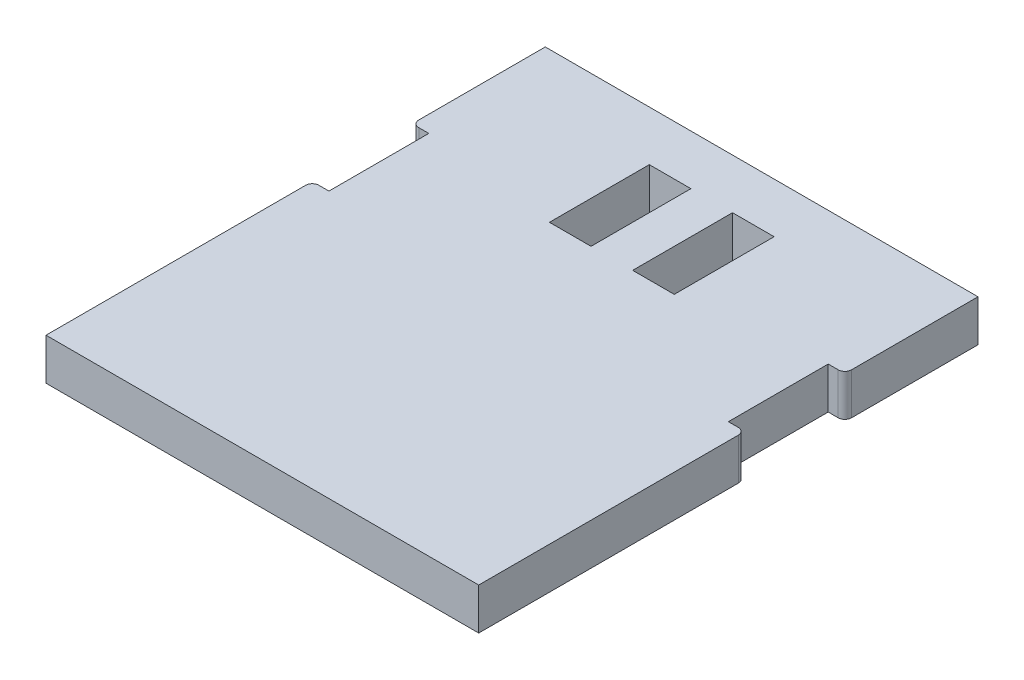
ISO-10303-21;
HEADER;
FILE_DESCRIPTION(('STEP AP214'),'2;1');
FILE_NAME('part.step','',(''),(''),'','','');
FILE_SCHEMA(('AUTOMOTIVE_DESIGN { 1 0 10303 214 1 1 1 1 }'));
ENDSEC;
DATA;
#1=APPLICATION_CONTEXT('core data for automotive mechanical design processes');
#2=APPLICATION_PROTOCOL_DEFINITION('international standard','automotive_design',2000,#1);
#3=PRODUCT_CONTEXT('',#1,'mechanical');
#4=PRODUCT('Part','Part','',(#3));
#5=PRODUCT_RELATED_PRODUCT_CATEGORY('part','',(#4));
#6=PRODUCT_DEFINITION_FORMATION('','',#4);
#7=PRODUCT_DEFINITION_CONTEXT('part definition',#1,'design');
#8=PRODUCT_DEFINITION('design','',#6,#7);
#9=PRODUCT_DEFINITION_SHAPE('','',#8);
#10=(LENGTH_UNIT() NAMED_UNIT(*) SI_UNIT(.MILLI.,.METRE.));
#11=(NAMED_UNIT(*) PLANE_ANGLE_UNIT() SI_UNIT($,.RADIAN.));
#12=(NAMED_UNIT(*) SI_UNIT($,.STERADIAN.) SOLID_ANGLE_UNIT());
#13=UNCERTAINTY_MEASURE_WITH_UNIT(LENGTH_MEASURE(1.E-05),#10,'distance_accuracy_value','');
#14=(GEOMETRIC_REPRESENTATION_CONTEXT(3) GLOBAL_UNCERTAINTY_ASSIGNED_CONTEXT((#13)) GLOBAL_UNIT_ASSIGNED_CONTEXT((#10,
#11,#12)) REPRESENTATION_CONTEXT('',''));
#15=CARTESIAN_POINT('',(0.,0.,0.));
#16=DIRECTION('',(0.,0.,1.));
#17=DIRECTION('',(1.,0.,0.));
#18=AXIS2_PLACEMENT_3D('',#15,#16,#17);
#19=CARTESIAN_POINT('',(0.,3.175,0.));
#20=DIRECTION('',(1.,0.,0.));
#21=DIRECTION('',(0.,0.,-1.));
#22=AXIS2_PLACEMENT_3D('',#19,#20,#21);
#23=PLANE('',#22);
#24=DIRECTION('',(0.,0.,1.));
#25=VECTOR('',#24,1.);
#26=CARTESIAN_POINT('',(0.,3.175,0.));
#27=LINE('',#26,#25);
#28=CARTESIAN_POINT('',(0.,3.175,-19.812));
#29=VERTEX_POINT('',#28);
#30=CARTESIAN_POINT('',(0.,3.175,0.));
#31=VERTEX_POINT('',#30);
#32=EDGE_CURVE('E321',#29,#31,#27,.T.);
#33=ORIENTED_EDGE('',*,*,#32,.F.);
#34=DIRECTION('',(0.,-1.,0.));
#35=VECTOR('',#34,1.);
#36=CARTESIAN_POINT('',(0.,3.175,-19.812));
#37=LINE('',#36,#35);
#38=CARTESIAN_POINT('',(0.,0.,-19.812));
#39=VERTEX_POINT('',#38);
#40=EDGE_CURVE('E47',#29,#39,#37,.T.);
#41=ORIENTED_EDGE('',*,*,#40,.T.);
#42=DIRECTION('',(0.,0.,1.));
#43=VECTOR('',#42,1.);
#44=CARTESIAN_POINT('',(0.,0.,0.));
#45=LINE('',#44,#43);
#46=CARTESIAN_POINT('',(0.,0.,0.));
#47=VERTEX_POINT('',#46);
#48=EDGE_CURVE('E316',#39,#47,#45,.T.);
#49=ORIENTED_EDGE('',*,*,#48,.T.);
#50=DIRECTION('',(0.,-1.,0.));
#51=VECTOR('',#50,1.);
#52=CARTESIAN_POINT('',(0.,3.175,0.));
#53=LINE('',#52,#51);
#54=EDGE_CURVE('E347',#31,#47,#53,.T.);
#55=ORIENTED_EDGE('',*,*,#54,.F.);
#56=EDGE_LOOP('',(#33,#41,#49,#55));
#57=FACE_BOUND('',#56,.T.);
#58=ADVANCED_FACE('F39',(#57),#23,.F.);
#59=CARTESIAN_POINT('',(33.02,3.175,0.));
#60=DIRECTION('',(-1.,0.,0.));
#61=DIRECTION('',(0.,0.,1.));
#62=AXIS2_PLACEMENT_3D('',#59,#60,#61);
#63=PLANE('',#62);
#64=DIRECTION('',(0.,0.,-1.));
#65=VECTOR('',#64,1.);
#66=CARTESIAN_POINT('',(33.02,3.175,0.));
#67=LINE('',#66,#65);
#68=CARTESIAN_POINT('',(33.02,3.175,-28.448));
#69=VERTEX_POINT('',#68);
#70=CARTESIAN_POINT('',(33.02,3.175,-38.1));
#71=VERTEX_POINT('',#70);
#72=EDGE_CURVE('E323',#69,#71,#67,.T.);
#73=ORIENTED_EDGE('',*,*,#72,.F.);
#74=DIRECTION('',(0.,-1.,0.));
#75=VECTOR('',#74,1.);
#76=CARTESIAN_POINT('',(33.02,3.175,-28.448));
#77=LINE('',#76,#75);
#78=CARTESIAN_POINT('',(33.02,0.,-28.448));
#79=VERTEX_POINT('',#78);
#80=EDGE_CURVE('E350',#69,#79,#77,.T.);
#81=ORIENTED_EDGE('',*,*,#80,.T.);
#82=DIRECTION('',(0.,0.,-1.));
#83=VECTOR('',#82,1.);
#84=CARTESIAN_POINT('',(33.02,0.,0.));
#85=LINE('',#84,#83);
#86=CARTESIAN_POINT('',(33.02,0.,-38.1));
#87=VERTEX_POINT('',#86);
#88=EDGE_CURVE('E334',#79,#87,#85,.T.);
#89=ORIENTED_EDGE('',*,*,#88,.T.);
#90=DIRECTION('',(0.,-1.,0.));
#91=VECTOR('',#90,1.);
#92=CARTESIAN_POINT('',(33.02,3.175,-38.1));
#93=LINE('',#92,#91);
#94=EDGE_CURVE('E341',#71,#87,#93,.T.);
#95=ORIENTED_EDGE('',*,*,#94,.F.);
#96=EDGE_LOOP('',(#73,#81,#89,#95));
#97=FACE_BOUND('',#96,.T.);
#98=ADVANCED_FACE('F427',(#97),#63,.F.);
#99=CARTESIAN_POINT('',(0.,3.175,0.));
#100=DIRECTION('',(0.,-1.,0.));
#101=DIRECTION('',(0.,0.,-1.));
#102=AXIS2_PLACEMENT_3D('',#99,#100,#101);
#103=PLANE('',#102);
#104=DIRECTION('',(0.,0.,1.));
#105=VECTOR('',#104,1.);
#106=CARTESIAN_POINT('',(11.7475,3.175,-34.29));
#107=LINE('',#106,#105);
#108=CARTESIAN_POINT('',(11.7475,3.175,-34.29));
#109=VERTEX_POINT('',#108);
#110=CARTESIAN_POINT('',(11.7475,3.175,-26.67));
#111=VERTEX_POINT('',#110);
#112=EDGE_CURVE('E286',#109,#111,#107,.T.);
#113=ORIENTED_EDGE('',*,*,#112,.F.);
#114=DIRECTION('',(-1.,0.,0.));
#115=VECTOR('',#114,1.);
#116=CARTESIAN_POINT('',(11.7475,3.175,-34.29));
#117=LINE('',#116,#115);
#118=CARTESIAN_POINT('',(14.9225,3.175,-34.29));
#119=VERTEX_POINT('',#118);
#120=EDGE_CURVE('E294',#119,#109,#117,.T.);
#121=ORIENTED_EDGE('',*,*,#120,.F.);
#122=DIRECTION('',(0.,0.,-1.));
#123=VECTOR('',#122,1.);
#124=CARTESIAN_POINT('',(14.9225,3.175,-34.29));
#125=LINE('',#124,#123);
#126=CARTESIAN_POINT('',(14.9225,3.175,-26.67));
#127=VERTEX_POINT('',#126);
#128=EDGE_CURVE('E291',#127,#119,#125,.T.);
#129=ORIENTED_EDGE('',*,*,#128,.F.);
#130=DIRECTION('',(1.,0.,0.));
#131=VECTOR('',#130,1.);
#132=CARTESIAN_POINT('',(11.7475,3.175,-26.67));
#133=LINE('',#132,#131);
#134=EDGE_CURVE('E288',#111,#127,#133,.T.);
#135=ORIENTED_EDGE('',*,*,#134,.F.);
#136=EDGE_LOOP('',(#113,#121,#129,#135));
#137=FACE_BOUND('',#136,.T.);
#138=DIRECTION('',(1.,0.,0.));
#139=VECTOR('',#138,1.);
#140=CARTESIAN_POINT('',(33.02,3.175,-27.94));
#141=LINE('',#140,#139);
#142=CARTESIAN_POINT('',(31.75,3.175,-27.94));
#143=VERTEX_POINT('',#142);
#144=CARTESIAN_POINT('',(32.512,3.175,-27.94));
#145=VERTEX_POINT('',#144);
#146=EDGE_CURVE('E220',#143,#145,#141,.T.);
#147=ORIENTED_EDGE('',*,*,#146,.T.);
#148=CARTESIAN_POINT('',(32.512,3.175,-28.448));
#149=DIRECTION('',(0.,-1.,0.));
#150=DIRECTION('',(0.,0.,-1.));
#151=AXIS2_PLACEMENT_3D('',#148,#149,#150);
#152=CIRCLE('',#151,0.508);
#153=EDGE_CURVE('E368',#145,#69,#152,.F.);
#154=ORIENTED_EDGE('',*,*,#153,.T.);
#155=ORIENTED_EDGE('',*,*,#72,.T.);
#156=DIRECTION('',(-1.,0.,0.));
#157=VECTOR('',#156,1.);
#158=CARTESIAN_POINT('',(0.,3.175,-38.1));
#159=LINE('',#158,#157);
#160=CARTESIAN_POINT('',(0.,3.175,-38.1));
#161=VERTEX_POINT('',#160);
#162=EDGE_CURVE('E326',#71,#161,#159,.T.);
#163=ORIENTED_EDGE('',*,*,#162,.T.);
#164=CARTESIAN_POINT('',(0.,3.175,-28.448));
#165=VERTEX_POINT('',#164);
#166=EDGE_CURVE('E317',#161,#165,#27,.T.);
#167=ORIENTED_EDGE('',*,*,#166,.T.);
#168=CARTESIAN_POINT('',(0.508,3.175,-28.448));
#169=DIRECTION('',(0.,-1.,0.));
#170=DIRECTION('',(0.,0.,-1.));
#171=AXIS2_PLACEMENT_3D('',#168,#169,#170);
#172=CIRCLE('',#171,0.508);
#173=CARTESIAN_POINT('',(0.508,3.175,-27.94));
#174=VERTEX_POINT('',#173);
#175=EDGE_CURVE('E365',#165,#174,#172,.F.);
#176=ORIENTED_EDGE('',*,*,#175,.T.);
#177=DIRECTION('',(1.,0.,0.));
#178=VECTOR('',#177,1.);
#179=CARTESIAN_POINT('',(0.,3.175,-27.94));
#180=LINE('',#179,#178);
#181=CARTESIAN_POINT('',(1.27,3.175,-27.94));
#182=VERTEX_POINT('',#181);
#183=EDGE_CURVE('E245',#174,#182,#180,.T.);
#184=ORIENTED_EDGE('',*,*,#183,.T.);
#185=DIRECTION('',(0.,0.,1.));
#186=VECTOR('',#185,1.);
#187=CARTESIAN_POINT('',(1.27,3.175,-20.32));
#188=LINE('',#187,#186);
#189=CARTESIAN_POINT('',(1.27,3.175,-20.32));
#190=VERTEX_POINT('',#189);
#191=EDGE_CURVE('E251',#182,#190,#188,.T.);
#192=ORIENTED_EDGE('',*,*,#191,.T.);
#193=DIRECTION('',(-1.,0.,0.));
#194=VECTOR('',#193,1.);
#195=CARTESIAN_POINT('',(0.,3.175,-20.32));
#196=LINE('',#195,#194);
#197=CARTESIAN_POINT('',(0.508,3.175,-20.32));
#198=VERTEX_POINT('',#197);
#199=EDGE_CURVE('E238',#190,#198,#196,.T.);
#200=ORIENTED_EDGE('',*,*,#199,.T.);
#201=CARTESIAN_POINT('',(0.508,3.175,-19.812));
#202=DIRECTION('',(0.,-1.,0.));
#203=DIRECTION('',(0.,0.,-1.));
#204=AXIS2_PLACEMENT_3D('',#201,#202,#203);
#205=CIRCLE('',#204,0.508);
#206=EDGE_CURVE('E363',#198,#29,#205,.F.);
#207=ORIENTED_EDGE('',*,*,#206,.T.);
#208=ORIENTED_EDGE('',*,*,#32,.T.);
#209=DIRECTION('',(1.,0.,0.));
#210=VECTOR('',#209,1.);
#211=CARTESIAN_POINT('',(0.,3.175,0.));
#212=LINE('',#211,#210);
#213=CARTESIAN_POINT('',(33.02,3.175,0.));
#214=VERTEX_POINT('',#213);
#215=EDGE_CURVE('E320',#31,#214,#212,.T.);
#216=ORIENTED_EDGE('',*,*,#215,.T.);
#217=CARTESIAN_POINT('',(33.02,3.175,-19.812));
#218=VERTEX_POINT('',#217);
#219=EDGE_CURVE('E324',#214,#218,#67,.T.);
#220=ORIENTED_EDGE('',*,*,#219,.T.);
#221=CARTESIAN_POINT('',(32.512,3.175,-19.812));
#222=DIRECTION('',(0.,-1.,0.));
#223=DIRECTION('',(0.,0.,-1.));
#224=AXIS2_PLACEMENT_3D('',#221,#222,#223);
#225=CIRCLE('',#224,0.508);
#226=CARTESIAN_POINT('',(32.512,3.175,-20.32));
#227=VERTEX_POINT('',#226);
#228=EDGE_CURVE('E54',#218,#227,#225,.F.);
#229=ORIENTED_EDGE('',*,*,#228,.T.);
#230=DIRECTION('',(-1.,0.,0.));
#231=VECTOR('',#230,1.);
#232=CARTESIAN_POINT('',(33.02,3.175,-20.32));
#233=LINE('',#232,#231);
#234=CARTESIAN_POINT('',(31.75,3.175,-20.32));
#235=VERTEX_POINT('',#234);
#236=EDGE_CURVE('E199',#227,#235,#233,.T.);
#237=ORIENTED_EDGE('',*,*,#236,.T.);
#238=DIRECTION('',(0.,0.,-1.));
#239=VECTOR('',#238,1.);
#240=CARTESIAN_POINT('',(31.75,3.175,-20.32));
#241=LINE('',#240,#239);
#242=EDGE_CURVE('E205',#235,#143,#241,.T.);
#243=ORIENTED_EDGE('',*,*,#242,.T.);
#244=EDGE_LOOP('',(#147,#154,#155,#163,#167,#176,#184,#192,#200,#207,#208,#216,#220,#229,#237,#243));
#245=FACE_BOUND('',#244,.T.);
#246=DIRECTION('',(0.,0.,1.));
#247=VECTOR('',#246,1.);
#248=CARTESIAN_POINT('',(18.0975,3.175,-34.29));
#249=LINE('',#248,#247);
#250=CARTESIAN_POINT('',(18.0975,3.175,-34.29));
#251=VERTEX_POINT('',#250);
#252=CARTESIAN_POINT('',(18.0975,3.175,-26.67));
#253=VERTEX_POINT('',#252);
#254=EDGE_CURVE('E255',#251,#253,#249,.T.);
#255=ORIENTED_EDGE('',*,*,#254,.F.);
#256=DIRECTION('',(-1.,0.,0.));
#257=VECTOR('',#256,1.);
#258=CARTESIAN_POINT('',(18.0975,3.175,-34.29));
#259=LINE('',#258,#257);
#260=CARTESIAN_POINT('',(21.2725,3.175,-34.29));
#261=VERTEX_POINT('',#260);
#262=EDGE_CURVE('E263',#261,#251,#259,.T.);
#263=ORIENTED_EDGE('',*,*,#262,.F.);
#264=DIRECTION('',(0.,0.,-1.));
#265=VECTOR('',#264,1.);
#266=CARTESIAN_POINT('',(21.2725,3.175,-34.29));
#267=LINE('',#266,#265);
#268=CARTESIAN_POINT('',(21.2725,3.175,-26.67));
#269=VERTEX_POINT('',#268);
#270=EDGE_CURVE('E260',#269,#261,#267,.T.);
#271=ORIENTED_EDGE('',*,*,#270,.F.);
#272=DIRECTION('',(1.,0.,0.));
#273=VECTOR('',#272,1.);
#274=CARTESIAN_POINT('',(18.0975,3.175,-26.67));
#275=LINE('',#274,#273);
#276=EDGE_CURVE('E257',#253,#269,#275,.T.);
#277=ORIENTED_EDGE('',*,*,#276,.F.);
#278=EDGE_LOOP('',(#255,#263,#271,#277));
#279=FACE_BOUND('',#278,.T.);
#280=ADVANCED_FACE('F202',(#137,#245,#279),#103,.F.);
#281=CARTESIAN_POINT('',(0.,0.,0.));
#282=DIRECTION('',(0.,-1.,0.));
#283=DIRECTION('',(0.,0.,-1.));
#284=AXIS2_PLACEMENT_3D('',#281,#282,#283);
#285=PLANE('',#284);
#286=ORIENTED_EDGE('',*,*,#88,.F.);
#287=CARTESIAN_POINT('',(32.512,0.,-28.448));
#288=DIRECTION('',(0.,-1.,0.));
#289=DIRECTION('',(0.,0.,-1.));
#290=AXIS2_PLACEMENT_3D('',#287,#288,#289);
#291=CIRCLE('',#290,0.508);
#292=CARTESIAN_POINT('',(32.512,0.,-27.94));
#293=VERTEX_POINT('',#292);
#294=EDGE_CURVE('E359',#79,#293,#291,.T.);
#295=ORIENTED_EDGE('',*,*,#294,.T.);
#296=DIRECTION('',(1.,0.,0.));
#297=VECTOR('',#296,1.);
#298=CARTESIAN_POINT('',(33.02,0.,-27.94));
#299=LINE('',#298,#297);
#300=CARTESIAN_POINT('',(31.75,0.,-27.94));
#301=VERTEX_POINT('',#300);
#302=EDGE_CURVE('E209',#301,#293,#299,.T.);
#303=ORIENTED_EDGE('',*,*,#302,.F.);
#304=DIRECTION('',(0.,0.,-1.));
#305=VECTOR('',#304,1.);
#306=CARTESIAN_POINT('',(31.75,0.,-20.32));
#307=LINE('',#306,#305);
#308=CARTESIAN_POINT('',(31.75,0.,-20.32));
#309=VERTEX_POINT('',#308);
#310=EDGE_CURVE('E228',#309,#301,#307,.T.);
#311=ORIENTED_EDGE('',*,*,#310,.F.);
#312=DIRECTION('',(-1.,0.,0.));
#313=VECTOR('',#312,1.);
#314=CARTESIAN_POINT('',(33.02,0.,-20.32));
#315=LINE('',#314,#313);
#316=CARTESIAN_POINT('',(32.512,0.,-20.32));
#317=VERTEX_POINT('',#316);
#318=EDGE_CURVE('E215',#317,#309,#315,.T.);
#319=ORIENTED_EDGE('',*,*,#318,.F.);
#320=CARTESIAN_POINT('',(32.512,0.,-19.812));
#321=DIRECTION('',(0.,-1.,0.));
#322=DIRECTION('',(0.,0.,-1.));
#323=AXIS2_PLACEMENT_3D('',#320,#321,#322);
#324=CIRCLE('',#323,0.508);
#325=CARTESIAN_POINT('',(33.02,0.,-19.812));
#326=VERTEX_POINT('',#325);
#327=EDGE_CURVE('E357',#317,#326,#324,.T.);
#328=ORIENTED_EDGE('',*,*,#327,.T.);
#329=CARTESIAN_POINT('',(33.02,0.,0.));
#330=VERTEX_POINT('',#329);
#331=EDGE_CURVE('E335',#330,#326,#85,.T.);
#332=ORIENTED_EDGE('',*,*,#331,.F.);
#333=DIRECTION('',(1.,0.,0.));
#334=VECTOR('',#333,1.);
#335=CARTESIAN_POINT('',(0.,0.,0.));
#336=LINE('',#335,#334);
#337=EDGE_CURVE('E332',#47,#330,#336,.T.);
#338=ORIENTED_EDGE('',*,*,#337,.F.);
#339=ORIENTED_EDGE('',*,*,#48,.F.);
#340=CARTESIAN_POINT('',(0.508,0.,-19.812));
#341=DIRECTION('',(0.,-1.,0.));
#342=DIRECTION('',(0.,0.,-1.));
#343=AXIS2_PLACEMENT_3D('',#340,#341,#342);
#344=CIRCLE('',#343,0.508);
#345=CARTESIAN_POINT('',(0.508,0.,-20.32));
#346=VERTEX_POINT('',#345);
#347=EDGE_CURVE('E353',#39,#346,#344,.T.);
#348=ORIENTED_EDGE('',*,*,#347,.T.);
#349=DIRECTION('',(-1.,0.,0.));
#350=VECTOR('',#349,1.);
#351=CARTESIAN_POINT('',(0.,0.,-20.32));
#352=LINE('',#351,#350);
#353=CARTESIAN_POINT('',(1.27,0.,-20.32));
#354=VERTEX_POINT('',#353);
#355=EDGE_CURVE('E241',#354,#346,#352,.T.);
#356=ORIENTED_EDGE('',*,*,#355,.F.);
#357=DIRECTION('',(0.,0.,1.));
#358=VECTOR('',#357,1.);
#359=CARTESIAN_POINT('',(1.27,0.,-20.32));
#360=LINE('',#359,#358);
#361=CARTESIAN_POINT('',(1.27,0.,-27.94));
#362=VERTEX_POINT('',#361);
#363=EDGE_CURVE('E244',#362,#354,#360,.T.);
#364=ORIENTED_EDGE('',*,*,#363,.F.);
#365=DIRECTION('',(1.,0.,0.));
#366=VECTOR('',#365,1.);
#367=CARTESIAN_POINT('',(0.,0.,-27.94));
#368=LINE('',#367,#366);
#369=CARTESIAN_POINT('',(0.508,0.,-27.94));
#370=VERTEX_POINT('',#369);
#371=EDGE_CURVE('E229',#370,#362,#368,.T.);
#372=ORIENTED_EDGE('',*,*,#371,.F.);
#373=CARTESIAN_POINT('',(0.508,0.,-28.448));
#374=DIRECTION('',(0.,-1.,0.));
#375=DIRECTION('',(0.,0.,-1.));
#376=AXIS2_PLACEMENT_3D('',#373,#374,#375);
#377=CIRCLE('',#376,0.508);
#378=CARTESIAN_POINT('',(0.,0.,-28.448));
#379=VERTEX_POINT('',#378);
#380=EDGE_CURVE('E355',#370,#379,#377,.T.);
#381=ORIENTED_EDGE('',*,*,#380,.T.);
#382=CARTESIAN_POINT('',(0.,0.,-38.1));
#383=VERTEX_POINT('',#382);
#384=EDGE_CURVE('E329',#383,#379,#45,.T.);
#385=ORIENTED_EDGE('',*,*,#384,.F.);
#386=DIRECTION('',(-1.,0.,0.));
#387=VECTOR('',#386,1.);
#388=CARTESIAN_POINT('',(0.,0.,-38.1));
#389=LINE('',#388,#387);
#390=EDGE_CURVE('E337',#87,#383,#389,.T.);
#391=ORIENTED_EDGE('',*,*,#390,.F.);
#392=EDGE_LOOP('',(#286,#295,#303,#311,#319,#328,#332,#338,#339,#348,#356,#364,#372,#381,#385,#391));
#393=FACE_BOUND('',#392,.T.);
#394=DIRECTION('',(-1.,0.,0.));
#395=VECTOR('',#394,1.);
#396=CARTESIAN_POINT('',(11.7475,0.,-34.29));
#397=LINE('',#396,#395);
#398=CARTESIAN_POINT('',(14.9225,0.,-34.29));
#399=VERTEX_POINT('',#398);
#400=CARTESIAN_POINT('',(11.7475,0.,-34.29));
#401=VERTEX_POINT('',#400);
#402=EDGE_CURVE('E289',#399,#401,#397,.T.);
#403=ORIENTED_EDGE('',*,*,#402,.T.);
#404=DIRECTION('',(0.,0.,1.));
#405=VECTOR('',#404,1.);
#406=CARTESIAN_POINT('',(11.7475,0.,-34.29));
#407=LINE('',#406,#405);
#408=CARTESIAN_POINT('',(11.7475,0.,-26.67));
#409=VERTEX_POINT('',#408);
#410=EDGE_CURVE('E285',#401,#409,#407,.T.);
#411=ORIENTED_EDGE('',*,*,#410,.T.);
#412=DIRECTION('',(1.,0.,0.));
#413=VECTOR('',#412,1.);
#414=CARTESIAN_POINT('',(11.7475,0.,-26.67));
#415=LINE('',#414,#413);
#416=CARTESIAN_POINT('',(14.9225,0.,-26.67));
#417=VERTEX_POINT('',#416);
#418=EDGE_CURVE('E299',#409,#417,#415,.T.);
#419=ORIENTED_EDGE('',*,*,#418,.T.);
#420=DIRECTION('',(0.,0.,-1.));
#421=VECTOR('',#420,1.);
#422=CARTESIAN_POINT('',(14.9225,0.,-34.29));
#423=LINE('',#422,#421);
#424=EDGE_CURVE('E302',#417,#399,#423,.T.);
#425=ORIENTED_EDGE('',*,*,#424,.T.);
#426=EDGE_LOOP('',(#403,#411,#419,#425));
#427=FACE_BOUND('',#426,.T.);
#428=DIRECTION('',(-1.,0.,0.));
#429=VECTOR('',#428,1.);
#430=CARTESIAN_POINT('',(18.0975,0.,-34.29));
#431=LINE('',#430,#429);
#432=CARTESIAN_POINT('',(21.2725,0.,-34.29));
#433=VERTEX_POINT('',#432);
#434=CARTESIAN_POINT('',(18.0975,0.,-34.29));
#435=VERTEX_POINT('',#434);
#436=EDGE_CURVE('E258',#433,#435,#431,.T.);
#437=ORIENTED_EDGE('',*,*,#436,.T.);
#438=DIRECTION('',(0.,0.,1.));
#439=VECTOR('',#438,1.);
#440=CARTESIAN_POINT('',(18.0975,0.,-34.29));
#441=LINE('',#440,#439);
#442=CARTESIAN_POINT('',(18.0975,0.,-26.67));
#443=VERTEX_POINT('',#442);
#444=EDGE_CURVE('E233',#435,#443,#441,.T.);
#445=ORIENTED_EDGE('',*,*,#444,.T.);
#446=DIRECTION('',(1.,0.,0.));
#447=VECTOR('',#446,1.);
#448=CARTESIAN_POINT('',(18.0975,0.,-26.67));
#449=LINE('',#448,#447);
#450=CARTESIAN_POINT('',(21.2725,0.,-26.67));
#451=VERTEX_POINT('',#450);
#452=EDGE_CURVE('E268',#443,#451,#449,.T.);
#453=ORIENTED_EDGE('',*,*,#452,.T.);
#454=DIRECTION('',(0.,0.,-1.));
#455=VECTOR('',#454,1.);
#456=CARTESIAN_POINT('',(21.2725,0.,-34.29));
#457=LINE('',#456,#455);
#458=EDGE_CURVE('E271',#451,#433,#457,.T.);
#459=ORIENTED_EDGE('',*,*,#458,.T.);
#460=EDGE_LOOP('',(#437,#445,#453,#459));
#461=FACE_BOUND('',#460,.T.);
#462=ADVANCED_FACE('F388',(#393,#427,#461),#285,.T.);
#463=ORIENTED_EDGE('',*,*,#384,.T.);
#464=DIRECTION('',(0.,-1.,0.));
#465=VECTOR('',#464,1.);
#466=CARTESIAN_POINT('',(0.,3.175,-28.448));
#467=LINE('',#466,#465);
#468=EDGE_CURVE('E376',#379,#165,#467,.F.);
#469=ORIENTED_EDGE('',*,*,#468,.T.);
#470=ORIENTED_EDGE('',*,*,#166,.F.);
#471=DIRECTION('',(0.,-1.,0.));
#472=VECTOR('',#471,1.);
#473=CARTESIAN_POINT('',(0.,3.175,-38.1));
#474=LINE('',#473,#472);
#475=EDGE_CURVE('E328',#161,#383,#474,.T.);
#476=ORIENTED_EDGE('',*,*,#475,.T.);
#477=EDGE_LOOP('',(#463,#469,#470,#476));
#478=FACE_BOUND('',#477,.T.);
#479=ADVANCED_FACE('F417',(#478),#23,.F.);
#480=CARTESIAN_POINT('',(0.,3.175,0.));
#481=DIRECTION('',(0.,0.,-1.));
#482=DIRECTION('',(-1.,0.,0.));
#483=AXIS2_PLACEMENT_3D('',#480,#481,#482);
#484=PLANE('',#483);
#485=ORIENTED_EDGE('',*,*,#337,.T.);
#486=DIRECTION('',(0.,-1.,0.));
#487=VECTOR('',#486,1.);
#488=CARTESIAN_POINT('',(33.02,3.175,0.));
#489=LINE('',#488,#487);
#490=EDGE_CURVE('E344',#214,#330,#489,.T.);
#491=ORIENTED_EDGE('',*,*,#490,.F.);
#492=ORIENTED_EDGE('',*,*,#215,.F.);
#493=ORIENTED_EDGE('',*,*,#54,.T.);
#494=EDGE_LOOP('',(#485,#491,#492,#493));
#495=FACE_BOUND('',#494,.T.);
#496=ADVANCED_FACE('F395',(#495),#484,.F.);
#497=ORIENTED_EDGE('',*,*,#331,.T.);
#498=DIRECTION('',(0.,-1.,0.));
#499=VECTOR('',#498,1.);
#500=CARTESIAN_POINT('',(33.02,3.175,-19.812));
#501=LINE('',#500,#499);
#502=EDGE_CURVE('E62',#326,#218,#501,.F.);
#503=ORIENTED_EDGE('',*,*,#502,.T.);
#504=ORIENTED_EDGE('',*,*,#219,.F.);
#505=ORIENTED_EDGE('',*,*,#490,.T.);
#506=EDGE_LOOP('',(#497,#503,#504,#505));
#507=FACE_BOUND('',#506,.T.);
#508=ADVANCED_FACE('F436',(#507),#63,.F.);
#509=CARTESIAN_POINT('',(0.,3.175,-38.1));
#510=DIRECTION('',(0.,0.,1.));
#511=DIRECTION('',(1.,0.,0.));
#512=AXIS2_PLACEMENT_3D('',#509,#510,#511);
#513=PLANE('',#512);
#514=ORIENTED_EDGE('',*,*,#390,.T.);
#515=ORIENTED_EDGE('',*,*,#475,.F.);
#516=ORIENTED_EDGE('',*,*,#162,.F.);
#517=ORIENTED_EDGE('',*,*,#94,.T.);
#518=EDGE_LOOP('',(#514,#515,#516,#517));
#519=FACE_BOUND('',#518,.T.);
#520=ADVANCED_FACE('F422',(#519),#513,.F.);
#521=CARTESIAN_POINT('',(11.7475,3.175,-34.29));
#522=DIRECTION('',(1.,0.,0.));
#523=DIRECTION('',(0.,0.,-1.));
#524=AXIS2_PLACEMENT_3D('',#521,#522,#523);
#525=PLANE('',#524);
#526=ORIENTED_EDGE('',*,*,#410,.F.);
#527=DIRECTION('',(0.,-1.,0.));
#528=VECTOR('',#527,1.);
#529=CARTESIAN_POINT('',(11.7475,3.175,-34.29));
#530=LINE('',#529,#528);
#531=EDGE_CURVE('E296',#109,#401,#530,.T.);
#532=ORIENTED_EDGE('',*,*,#531,.F.);
#533=ORIENTED_EDGE('',*,*,#112,.T.);
#534=DIRECTION('',(0.,-1.,0.));
#535=VECTOR('',#534,1.);
#536=CARTESIAN_POINT('',(11.7475,3.175,-26.67));
#537=LINE('',#536,#535);
#538=EDGE_CURVE('E313',#111,#409,#537,.T.);
#539=ORIENTED_EDGE('',*,*,#538,.T.);
#540=EDGE_LOOP('',(#526,#532,#533,#539));
#541=FACE_BOUND('',#540,.T.);
#542=ADVANCED_FACE('F468',(#541),#525,.T.);
#543=CARTESIAN_POINT('',(11.7475,3.175,-26.67));
#544=DIRECTION('',(0.,0.,-1.));
#545=DIRECTION('',(-1.,0.,0.));
#546=AXIS2_PLACEMENT_3D('',#543,#544,#545);
#547=PLANE('',#546);
#548=ORIENTED_EDGE('',*,*,#418,.F.);
#549=ORIENTED_EDGE('',*,*,#538,.F.);
#550=ORIENTED_EDGE('',*,*,#134,.T.);
#551=DIRECTION('',(0.,-1.,0.));
#552=VECTOR('',#551,1.);
#553=CARTESIAN_POINT('',(14.9225,3.175,-26.67));
#554=LINE('',#553,#552);
#555=EDGE_CURVE('E311',#127,#417,#554,.T.);
#556=ORIENTED_EDGE('',*,*,#555,.T.);
#557=EDGE_LOOP('',(#548,#549,#550,#556));
#558=FACE_BOUND('',#557,.T.);
#559=ADVANCED_FACE('F605',(#558),#547,.T.);
#560=CARTESIAN_POINT('',(14.9225,3.175,-34.29));
#561=DIRECTION('',(-1.,0.,0.));
#562=DIRECTION('',(0.,0.,1.));
#563=AXIS2_PLACEMENT_3D('',#560,#561,#562);
#564=PLANE('',#563);
#565=ORIENTED_EDGE('',*,*,#424,.F.);
#566=ORIENTED_EDGE('',*,*,#555,.F.);
#567=ORIENTED_EDGE('',*,*,#128,.T.);
#568=DIRECTION('',(0.,-1.,0.));
#569=VECTOR('',#568,1.);
#570=CARTESIAN_POINT('',(14.9225,3.175,-34.29));
#571=LINE('',#570,#569);
#572=EDGE_CURVE('E309',#119,#399,#571,.T.);
#573=ORIENTED_EDGE('',*,*,#572,.T.);
#574=EDGE_LOOP('',(#565,#566,#567,#573));
#575=FACE_BOUND('',#574,.T.);
#576=ADVANCED_FACE('F596',(#575),#564,.T.);
#577=CARTESIAN_POINT('',(11.7475,3.175,-34.29));
#578=DIRECTION('',(0.,0.,1.));
#579=DIRECTION('',(1.,0.,0.));
#580=AXIS2_PLACEMENT_3D('',#577,#578,#579);
#581=PLANE('',#580);
#582=ORIENTED_EDGE('',*,*,#402,.F.);
#583=ORIENTED_EDGE('',*,*,#572,.F.);
#584=ORIENTED_EDGE('',*,*,#120,.T.);
#585=ORIENTED_EDGE('',*,*,#531,.T.);
#586=EDGE_LOOP('',(#582,#583,#584,#585));
#587=FACE_BOUND('',#586,.T.);
#588=ADVANCED_FACE('F587',(#587),#581,.T.);
#589=CARTESIAN_POINT('',(18.0975,3.175,-34.29));
#590=DIRECTION('',(1.,0.,0.));
#591=DIRECTION('',(0.,0.,-1.));
#592=AXIS2_PLACEMENT_3D('',#589,#590,#591);
#593=PLANE('',#592);
#594=ORIENTED_EDGE('',*,*,#444,.F.);
#595=DIRECTION('',(0.,-1.,0.));
#596=VECTOR('',#595,1.);
#597=CARTESIAN_POINT('',(18.0975,3.175,-34.29));
#598=LINE('',#597,#596);
#599=EDGE_CURVE('E265',#251,#435,#598,.T.);
#600=ORIENTED_EDGE('',*,*,#599,.F.);
#601=ORIENTED_EDGE('',*,*,#254,.T.);
#602=DIRECTION('',(0.,-1.,0.));
#603=VECTOR('',#602,1.);
#604=CARTESIAN_POINT('',(18.0975,3.175,-26.67));
#605=LINE('',#604,#603);
#606=EDGE_CURVE('E282',#253,#443,#605,.T.);
#607=ORIENTED_EDGE('',*,*,#606,.T.);
#608=EDGE_LOOP('',(#594,#600,#601,#607));
#609=FACE_BOUND('',#608,.T.);
#610=ADVANCED_FACE('F578',(#609),#593,.T.);
#611=CARTESIAN_POINT('',(18.0975,3.175,-26.67));
#612=DIRECTION('',(0.,0.,-1.));
#613=DIRECTION('',(-1.,0.,0.));
#614=AXIS2_PLACEMENT_3D('',#611,#612,#613);
#615=PLANE('',#614);
#616=ORIENTED_EDGE('',*,*,#452,.F.);
#617=ORIENTED_EDGE('',*,*,#606,.F.);
#618=ORIENTED_EDGE('',*,*,#276,.T.);
#619=DIRECTION('',(0.,-1.,0.));
#620=VECTOR('',#619,1.);
#621=CARTESIAN_POINT('',(21.2725,3.175,-26.67));
#622=LINE('',#621,#620);
#623=EDGE_CURVE('E280',#269,#451,#622,.T.);
#624=ORIENTED_EDGE('',*,*,#623,.T.);
#625=EDGE_LOOP('',(#616,#617,#618,#624));
#626=FACE_BOUND('',#625,.T.);
#627=ADVANCED_FACE('F569',(#626),#615,.T.);
#628=CARTESIAN_POINT('',(21.2725,3.175,-34.29));
#629=DIRECTION('',(-1.,0.,0.));
#630=DIRECTION('',(0.,0.,1.));
#631=AXIS2_PLACEMENT_3D('',#628,#629,#630);
#632=PLANE('',#631);
#633=ORIENTED_EDGE('',*,*,#458,.F.);
#634=ORIENTED_EDGE('',*,*,#623,.F.);
#635=ORIENTED_EDGE('',*,*,#270,.T.);
#636=DIRECTION('',(0.,-1.,0.));
#637=VECTOR('',#636,1.);
#638=CARTESIAN_POINT('',(21.2725,3.175,-34.29));
#639=LINE('',#638,#637);
#640=EDGE_CURVE('E278',#261,#433,#639,.T.);
#641=ORIENTED_EDGE('',*,*,#640,.T.);
#642=EDGE_LOOP('',(#633,#634,#635,#641));
#643=FACE_BOUND('',#642,.T.);
#644=ADVANCED_FACE('F560',(#643),#632,.T.);
#645=CARTESIAN_POINT('',(18.0975,3.175,-34.29));
#646=DIRECTION('',(0.,0.,1.));
#647=DIRECTION('',(1.,0.,0.));
#648=AXIS2_PLACEMENT_3D('',#645,#646,#647);
#649=PLANE('',#648);
#650=ORIENTED_EDGE('',*,*,#436,.F.);
#651=ORIENTED_EDGE('',*,*,#640,.F.);
#652=ORIENTED_EDGE('',*,*,#262,.T.);
#653=ORIENTED_EDGE('',*,*,#599,.T.);
#654=EDGE_LOOP('',(#650,#651,#652,#653));
#655=FACE_BOUND('',#654,.T.);
#656=ADVANCED_FACE('F480',(#655),#649,.T.);
#657=CARTESIAN_POINT('',(33.02,3.175,-27.94));
#658=DIRECTION('',(0.,0.,-1.));
#659=DIRECTION('',(-1.,0.,0.));
#660=AXIS2_PLACEMENT_3D('',#657,#658,#659);
#661=PLANE('',#660);
#662=ORIENTED_EDGE('',*,*,#302,.T.);
#663=DIRECTION('',(0.,-1.,0.));
#664=VECTOR('',#663,1.);
#665=CARTESIAN_POINT('',(32.512,3.175,-27.94));
#666=LINE('',#665,#664);
#667=EDGE_CURVE('E361',#293,#145,#666,.F.);
#668=ORIENTED_EDGE('',*,*,#667,.T.);
#669=ORIENTED_EDGE('',*,*,#146,.F.);
#670=DIRECTION('',(0.,-1.,0.));
#671=VECTOR('',#670,1.);
#672=CARTESIAN_POINT('',(31.75,3.175,-27.94));
#673=LINE('',#672,#671);
#674=EDGE_CURVE('E219',#143,#301,#673,.T.);
#675=ORIENTED_EDGE('',*,*,#674,.T.);
#676=EDGE_LOOP('',(#662,#668,#669,#675));
#677=FACE_BOUND('',#676,.T.);
#678=ADVANCED_FACE('F434',(#677),#661,.F.);
#679=CARTESIAN_POINT('',(31.75,3.175,-20.32));
#680=DIRECTION('',(-1.,0.,0.));
#681=DIRECTION('',(0.,0.,1.));
#682=AXIS2_PLACEMENT_3D('',#679,#680,#681);
#683=PLANE('',#682);
#684=ORIENTED_EDGE('',*,*,#310,.T.);
#685=ORIENTED_EDGE('',*,*,#674,.F.);
#686=ORIENTED_EDGE('',*,*,#242,.F.);
#687=DIRECTION('',(0.,-1.,0.));
#688=VECTOR('',#687,1.);
#689=CARTESIAN_POINT('',(31.75,3.175,-20.32));
#690=LINE('',#689,#688);
#691=EDGE_CURVE('E212',#235,#309,#690,.T.);
#692=ORIENTED_EDGE('',*,*,#691,.T.);
#693=EDGE_LOOP('',(#684,#685,#686,#692));
#694=FACE_BOUND('',#693,.T.);
#695=ADVANCED_FACE('F222',(#694),#683,.F.);
#696=CARTESIAN_POINT('',(33.02,3.175,-20.32));
#697=DIRECTION('',(0.,0.,1.));
#698=DIRECTION('',(1.,0.,0.));
#699=AXIS2_PLACEMENT_3D('',#696,#697,#698);
#700=PLANE('',#699);
#701=ORIENTED_EDGE('',*,*,#236,.F.);
#702=DIRECTION('',(0.,-1.,0.));
#703=VECTOR('',#702,1.);
#704=CARTESIAN_POINT('',(32.512,3.175,-20.32));
#705=LINE('',#704,#703);
#706=EDGE_CURVE('E370',#227,#317,#705,.T.);
#707=ORIENTED_EDGE('',*,*,#706,.T.);
#708=ORIENTED_EDGE('',*,*,#318,.T.);
#709=ORIENTED_EDGE('',*,*,#691,.F.);
#710=EDGE_LOOP('',(#701,#707,#708,#709));
#711=FACE_BOUND('',#710,.T.);
#712=ADVANCED_FACE('F213',(#711),#700,.F.);
#713=CARTESIAN_POINT('',(0.,3.175,-20.32));
#714=DIRECTION('',(0.,0.,1.));
#715=DIRECTION('',(1.,0.,0.));
#716=AXIS2_PLACEMENT_3D('',#713,#714,#715);
#717=PLANE('',#716);
#718=ORIENTED_EDGE('',*,*,#355,.T.);
#719=DIRECTION('',(0.,-1.,0.));
#720=VECTOR('',#719,1.);
#721=CARTESIAN_POINT('',(0.508,3.175,-20.32));
#722=LINE('',#721,#720);
#723=EDGE_CURVE('E11',#346,#198,#722,.F.);
#724=ORIENTED_EDGE('',*,*,#723,.T.);
#725=ORIENTED_EDGE('',*,*,#199,.F.);
#726=DIRECTION('',(0.,-1.,0.));
#727=VECTOR('',#726,1.);
#728=CARTESIAN_POINT('',(1.27,3.175,-20.32));
#729=LINE('',#728,#727);
#730=EDGE_CURVE('E239',#190,#354,#729,.T.);
#731=ORIENTED_EDGE('',*,*,#730,.T.);
#732=EDGE_LOOP('',(#718,#724,#725,#731));
#733=FACE_BOUND('',#732,.T.);
#734=ADVANCED_FACE('F399',(#733),#717,.F.);
#735=CARTESIAN_POINT('',(1.27,3.175,-20.32));
#736=DIRECTION('',(1.,0.,0.));
#737=DIRECTION('',(0.,0.,-1.));
#738=AXIS2_PLACEMENT_3D('',#735,#736,#737);
#739=PLANE('',#738);
#740=ORIENTED_EDGE('',*,*,#363,.T.);
#741=ORIENTED_EDGE('',*,*,#730,.F.);
#742=ORIENTED_EDGE('',*,*,#191,.F.);
#743=DIRECTION('',(0.,-1.,0.));
#744=VECTOR('',#743,1.);
#745=CARTESIAN_POINT('',(1.27,3.175,-27.94));
#746=LINE('',#745,#744);
#747=EDGE_CURVE('E235',#182,#362,#746,.T.);
#748=ORIENTED_EDGE('',*,*,#747,.T.);
#749=EDGE_LOOP('',(#740,#741,#742,#748));
#750=FACE_BOUND('',#749,.T.);
#751=ADVANCED_FACE('F403',(#750),#739,.F.);
#752=CARTESIAN_POINT('',(0.,3.175,-27.94));
#753=DIRECTION('',(0.,0.,-1.));
#754=DIRECTION('',(-1.,0.,0.));
#755=AXIS2_PLACEMENT_3D('',#752,#753,#754);
#756=PLANE('',#755);
#757=ORIENTED_EDGE('',*,*,#183,.F.);
#758=DIRECTION('',(0.,-1.,0.));
#759=VECTOR('',#758,1.);
#760=CARTESIAN_POINT('',(0.508,3.175,-27.94));
#761=LINE('',#760,#759);
#762=EDGE_CURVE('E373',#174,#370,#761,.T.);
#763=ORIENTED_EDGE('',*,*,#762,.T.);
#764=ORIENTED_EDGE('',*,*,#371,.T.);
#765=ORIENTED_EDGE('',*,*,#747,.F.);
#766=EDGE_LOOP('',(#757,#763,#764,#765));
#767=FACE_BOUND('',#766,.T.);
#768=ADVANCED_FACE('F408',(#767),#756,.F.);
#769=CARTESIAN_POINT('',(32.512,3.175,-28.448));
#770=DIRECTION('',(0.,-1.,0.));
#771=DIRECTION('',(0.,0.,-1.));
#772=AXIS2_PLACEMENT_3D('',#769,#770,#771);
#773=CYLINDRICAL_SURFACE('',#772,0.508);
#774=ORIENTED_EDGE('',*,*,#153,.F.);
#775=ORIENTED_EDGE('',*,*,#667,.F.);
#776=ORIENTED_EDGE('',*,*,#294,.F.);
#777=ORIENTED_EDGE('',*,*,#80,.F.);
#778=EDGE_LOOP('',(#774,#775,#776,#777));
#779=FACE_BOUND('',#778,.T.);
#780=ADVANCED_FACE('F431',(#779),#773,.T.);
#781=CARTESIAN_POINT('',(32.512,3.175,-19.812));
#782=DIRECTION('',(0.,-1.,0.));
#783=DIRECTION('',(0.,0.,-1.));
#784=AXIS2_PLACEMENT_3D('',#781,#782,#783);
#785=CYLINDRICAL_SURFACE('',#784,0.508);
#786=ORIENTED_EDGE('',*,*,#228,.F.);
#787=ORIENTED_EDGE('',*,*,#502,.F.);
#788=ORIENTED_EDGE('',*,*,#327,.F.);
#789=ORIENTED_EDGE('',*,*,#706,.F.);
#790=EDGE_LOOP('',(#786,#787,#788,#789));
#791=FACE_BOUND('',#790,.T.);
#792=ADVANCED_FACE('F437',(#791),#785,.T.);
#793=CARTESIAN_POINT('',(0.508,3.175,-28.448));
#794=DIRECTION('',(0.,-1.,0.));
#795=DIRECTION('',(0.,0.,-1.));
#796=AXIS2_PLACEMENT_3D('',#793,#794,#795);
#797=CYLINDRICAL_SURFACE('',#796,0.508);
#798=ORIENTED_EDGE('',*,*,#175,.F.);
#799=ORIENTED_EDGE('',*,*,#468,.F.);
#800=ORIENTED_EDGE('',*,*,#380,.F.);
#801=ORIENTED_EDGE('',*,*,#762,.F.);
#802=EDGE_LOOP('',(#798,#799,#800,#801));
#803=FACE_BOUND('',#802,.T.);
#804=ADVANCED_FACE('F412',(#803),#797,.T.);
#805=CARTESIAN_POINT('',(0.508,3.175,-19.812));
#806=DIRECTION('',(0.,-1.,0.));
#807=DIRECTION('',(0.,0.,-1.));
#808=AXIS2_PLACEMENT_3D('',#805,#806,#807);
#809=CYLINDRICAL_SURFACE('',#808,0.508);
#810=ORIENTED_EDGE('',*,*,#206,.F.);
#811=ORIENTED_EDGE('',*,*,#723,.F.);
#812=ORIENTED_EDGE('',*,*,#347,.F.);
#813=ORIENTED_EDGE('',*,*,#40,.F.);
#814=EDGE_LOOP('',(#810,#811,#812,#813));
#815=FACE_BOUND('',#814,.T.);
#816=ADVANCED_FACE('F41',(#815),#809,.T.);
#817=CLOSED_SHELL('',(#58,#98,#280,#462,#479,#496,#508,#520,#542,#559,#576,#588,#610,#627,#644,
#656,#678,#695,#712,#734,#751,#768,#780,#792,#804,#816));
#818=MANIFOLD_SOLID_BREP('B2',#817);
#819=ADVANCED_BREP_SHAPE_REPRESENTATION('',(#18,#818),#14);
#820=SHAPE_DEFINITION_REPRESENTATION(#9,#819);
ENDSEC;
END-ISO-10303-21;
